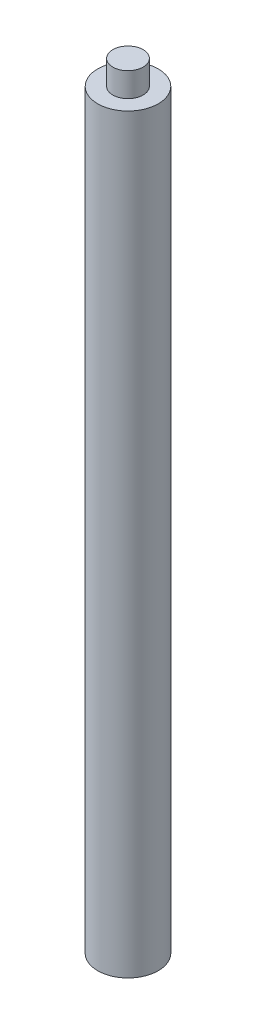
ISO-10303-21;
HEADER;
FILE_DESCRIPTION(('STEP AP214'),'2;1');
FILE_NAME('part.step','',(''),(''),'','','');
FILE_SCHEMA(('AUTOMOTIVE_DESIGN { 1 0 10303 214 1 1 1 1 }'));
ENDSEC;
DATA;
#1=APPLICATION_CONTEXT('core data for automotive mechanical design processes');
#2=APPLICATION_PROTOCOL_DEFINITION('international standard','automotive_design',2000,#1);
#3=PRODUCT_CONTEXT('',#1,'mechanical');
#4=PRODUCT('Part','Part','',(#3));
#5=PRODUCT_RELATED_PRODUCT_CATEGORY('part','',(#4));
#6=PRODUCT_DEFINITION_FORMATION('','',#4);
#7=PRODUCT_DEFINITION_CONTEXT('part definition',#1,'design');
#8=PRODUCT_DEFINITION('design','',#6,#7);
#9=PRODUCT_DEFINITION_SHAPE('','',#8);
#10=(LENGTH_UNIT() NAMED_UNIT(*) SI_UNIT(.MILLI.,.METRE.));
#11=(NAMED_UNIT(*) PLANE_ANGLE_UNIT() SI_UNIT($,.RADIAN.));
#12=(NAMED_UNIT(*) SI_UNIT($,.STERADIAN.) SOLID_ANGLE_UNIT());
#13=UNCERTAINTY_MEASURE_WITH_UNIT(LENGTH_MEASURE(1.E-05),#10,'distance_accuracy_value','');
#14=(GEOMETRIC_REPRESENTATION_CONTEXT(3) GLOBAL_UNCERTAINTY_ASSIGNED_CONTEXT((#13)) GLOBAL_UNIT_ASSIGNED_CONTEXT((#10,
#11,#12)) REPRESENTATION_CONTEXT('',''));
#15=CARTESIAN_POINT('',(0.,0.,0.));
#16=DIRECTION('',(0.,0.,1.));
#17=DIRECTION('',(1.,0.,0.));
#18=AXIS2_PLACEMENT_3D('',#15,#16,#17);
#19=CARTESIAN_POINT('',(0.,124.,0.));
#20=DIRECTION('',(0.,-1.,0.));
#21=DIRECTION('',(0.,0.,-1.));
#22=AXIS2_PLACEMENT_3D('',#19,#20,#21);
#23=CYLINDRICAL_SURFACE('',#22,10.);
#24=CARTESIAN_POINT('',(0.,124.,0.));
#25=DIRECTION('',(0.,1.,0.));
#26=DIRECTION('',(0.,0.,1.));
#27=AXIS2_PLACEMENT_3D('',#24,#25,#26);
#28=CIRCLE('',#27,10.);
#29=CARTESIAN_POINT('',(0.,124.,10.));
#30=VERTEX_POINT('',#29);
#31=EDGE_CURVE('E37',#30,#30,#28,.T.);
#32=ORIENTED_EDGE('',*,*,#31,.F.);
#33=EDGE_LOOP('',(#32));
#34=FACE_BOUND('',#33,.T.);
#35=CARTESIAN_POINT('',(0.,-124.,0.));
#36=DIRECTION('',(0.,1.,0.));
#37=DIRECTION('',(0.,0.,1.));
#38=AXIS2_PLACEMENT_3D('',#35,#36,#37);
#39=CIRCLE('',#38,10.);
#40=CARTESIAN_POINT('',(0.,-124.,10.));
#41=VERTEX_POINT('',#40);
#42=EDGE_CURVE('E33',#41,#41,#39,.T.);
#43=ORIENTED_EDGE('',*,*,#42,.T.);
#44=EDGE_LOOP('',(#43));
#45=FACE_BOUND('',#44,.T.);
#46=ADVANCED_FACE('F30',(#34,#45),#23,.T.);
#47=CARTESIAN_POINT('',(0.,124.,0.));
#48=DIRECTION('',(0.,1.,0.));
#49=DIRECTION('',(0.,0.,1.));
#50=AXIS2_PLACEMENT_3D('',#47,#48,#49);
#51=PLANE('',#50);
#52=CARTESIAN_POINT('',(0.,124.,0.));
#53=DIRECTION('',(0.,1.,0.));
#54=DIRECTION('',(0.,0.,1.));
#55=AXIS2_PLACEMENT_3D('',#52,#53,#54);
#56=CIRCLE('',#55,5.);
#57=CARTESIAN_POINT('',(0.,124.,5.));
#58=VERTEX_POINT('',#57);
#59=EDGE_CURVE('E10',#58,#58,#56,.T.);
#60=ORIENTED_EDGE('',*,*,#59,.F.);
#61=EDGE_LOOP('',(#60));
#62=FACE_BOUND('',#61,.T.);
#63=ORIENTED_EDGE('',*,*,#31,.T.);
#64=EDGE_LOOP('',(#63));
#65=FACE_BOUND('',#64,.T.);
#66=ADVANCED_FACE('F54',(#62,#65),#51,.T.);
#67=CARTESIAN_POINT('',(0.,-124.,0.));
#68=DIRECTION('',(0.,1.,0.));
#69=DIRECTION('',(0.,0.,1.));
#70=AXIS2_PLACEMENT_3D('',#67,#68,#69);
#71=PLANE('',#70);
#72=ORIENTED_EDGE('',*,*,#42,.F.);
#73=EDGE_LOOP('',(#72));
#74=FACE_BOUND('',#73,.T.);
#75=ADVANCED_FACE('F51',(#74),#71,.F.);
#76=CARTESIAN_POINT('',(0.,132.,0.));
#77=DIRECTION('',(0.,-1.,0.));
#78=DIRECTION('',(0.,0.,-1.));
#79=AXIS2_PLACEMENT_3D('',#76,#77,#78);
#80=CYLINDRICAL_SURFACE('',#79,5.);
#81=CARTESIAN_POINT('',(0.,132.,0.));
#82=DIRECTION('',(0.,1.,0.));
#83=DIRECTION('',(0.,0.,1.));
#84=AXIS2_PLACEMENT_3D('',#81,#82,#83);
#85=CIRCLE('',#84,5.);
#86=CARTESIAN_POINT('',(0.,132.,5.));
#87=VERTEX_POINT('',#86);
#88=EDGE_CURVE('E43',#87,#87,#85,.T.);
#89=ORIENTED_EDGE('',*,*,#88,.F.);
#90=EDGE_LOOP('',(#89));
#91=FACE_BOUND('',#90,.T.);
#92=ORIENTED_EDGE('',*,*,#59,.T.);
#93=EDGE_LOOP('',(#92));
#94=FACE_BOUND('',#93,.T.);
#95=ADVANCED_FACE('F53',(#91,#94),#80,.T.);
#96=CARTESIAN_POINT('',(0.,132.,0.));
#97=DIRECTION('',(0.,1.,0.));
#98=DIRECTION('',(0.,0.,1.));
#99=AXIS2_PLACEMENT_3D('',#96,#97,#98);
#100=PLANE('',#99);
#101=ORIENTED_EDGE('',*,*,#88,.T.);
#102=EDGE_LOOP('',(#101));
#103=FACE_BOUND('',#102,.T.);
#104=ADVANCED_FACE('F59',(#103),#100,.T.);
#105=CLOSED_SHELL('',(#46,#66,#75,#95,#104));
#106=MANIFOLD_SOLID_BREP('B2',#105);
#107=ADVANCED_BREP_SHAPE_REPRESENTATION('',(#18,#106),#14);
#108=SHAPE_DEFINITION_REPRESENTATION(#9,#107);
ENDSEC;
END-ISO-10303-21;
